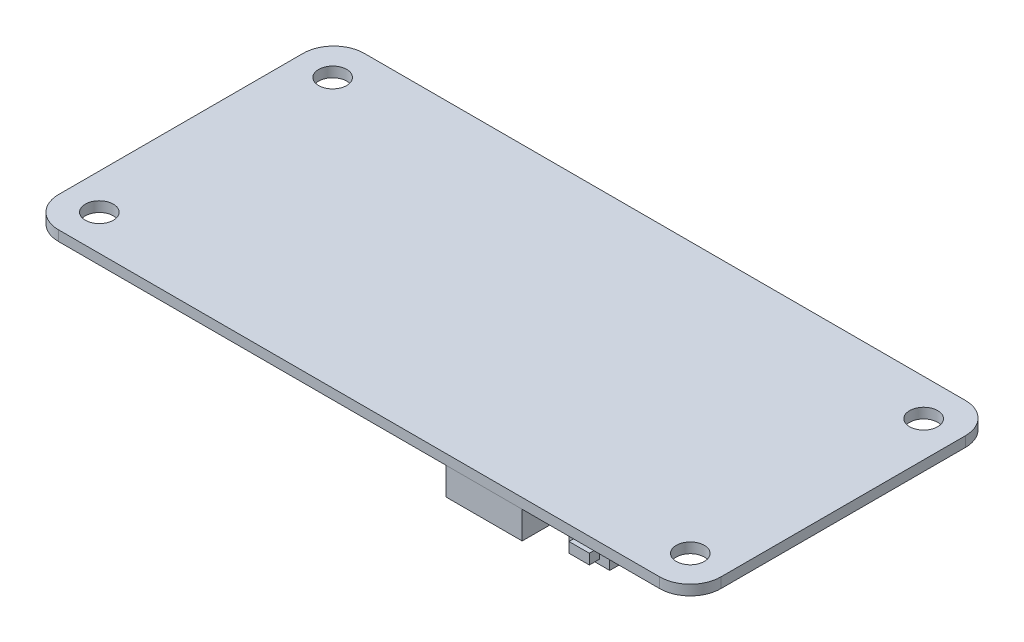
ISO-10303-21;
HEADER;
FILE_DESCRIPTION(('STEP AP214'),'2;1');
FILE_NAME('part.step','',(''),(''),'','','');
FILE_SCHEMA(('AUTOMOTIVE_DESIGN { 1 0 10303 214 1 1 1 1 }'));
ENDSEC;
DATA;
#1=APPLICATION_CONTEXT('core data for automotive mechanical design processes');
#2=APPLICATION_PROTOCOL_DEFINITION('international standard','automotive_design',2000,#1);
#3=PRODUCT_CONTEXT('',#1,'mechanical');
#4=PRODUCT('Part','Part','',(#3));
#5=PRODUCT_RELATED_PRODUCT_CATEGORY('part','',(#4));
#6=PRODUCT_DEFINITION_FORMATION('','',#4);
#7=PRODUCT_DEFINITION_CONTEXT('part definition',#1,'design');
#8=PRODUCT_DEFINITION('design','',#6,#7);
#9=PRODUCT_DEFINITION_SHAPE('','',#8);
#10=(LENGTH_UNIT() NAMED_UNIT(*) SI_UNIT(.MILLI.,.METRE.));
#11=(NAMED_UNIT(*) PLANE_ANGLE_UNIT() SI_UNIT($,.RADIAN.));
#12=(NAMED_UNIT(*) SI_UNIT($,.STERADIAN.) SOLID_ANGLE_UNIT());
#13=UNCERTAINTY_MEASURE_WITH_UNIT(LENGTH_MEASURE(1.E-05),#10,'distance_accuracy_value','');
#14=(GEOMETRIC_REPRESENTATION_CONTEXT(3) GLOBAL_UNCERTAINTY_ASSIGNED_CONTEXT((#13)) GLOBAL_UNIT_ASSIGNED_CONTEXT((#10,
#11,#12)) REPRESENTATION_CONTEXT('',''));
#15=CARTESIAN_POINT('',(0.,0.,0.));
#16=DIRECTION('',(0.,0.,1.));
#17=DIRECTION('',(1.,0.,0.));
#18=AXIS2_PLACEMENT_3D('',#15,#16,#17);
#19=CARTESIAN_POINT('',(23.5,-2.,13.9082141449593));
#20=DIRECTION('',(1.,0.,0.));
#21=DIRECTION('',(0.,0.,-1.));
#22=AXIS2_PLACEMENT_3D('',#19,#20,#21);
#23=PLANE('',#22);
#24=DIRECTION('',(0.,0.,-1.));
#25=VECTOR('',#24,1.);
#26=CARTESIAN_POINT('',(23.5,0.,13.9082141449593));
#27=LINE('',#26,#25);
#28=CARTESIAN_POINT('',(23.5,0.,13.9082141449593));
#29=VERTEX_POINT('',#28);
#30=CARTESIAN_POINT('',(23.5,0.,11.5));
#31=VERTEX_POINT('',#30);
#32=EDGE_CURVE('E131',#29,#31,#27,.T.);
#33=ORIENTED_EDGE('',*,*,#32,.F.);
#34=DIRECTION('',(0.,1.,0.));
#35=VECTOR('',#34,1.);
#36=CARTESIAN_POINT('',(23.5,-2.,13.9082141449593));
#37=LINE('',#36,#35);
#38=CARTESIAN_POINT('',(23.5,-2.,13.9082141449593));
#39=VERTEX_POINT('',#38);
#40=EDGE_CURVE('E12',#39,#29,#37,.T.);
#41=ORIENTED_EDGE('',*,*,#40,.F.);
#42=DIRECTION('',(0.,0.,-1.));
#43=VECTOR('',#42,1.);
#44=CARTESIAN_POINT('',(23.5,-2.,13.9082141449593));
#45=LINE('',#44,#43);
#46=CARTESIAN_POINT('',(23.5,-2.,11.5));
#47=VERTEX_POINT('',#46);
#48=EDGE_CURVE('E140',#39,#47,#45,.T.);
#49=ORIENTED_EDGE('',*,*,#48,.T.);
#50=DIRECTION('',(0.,1.,0.));
#51=VECTOR('',#50,1.);
#52=CARTESIAN_POINT('',(23.5,-2.,11.5));
#53=LINE('',#52,#51);
#54=EDGE_CURVE('E49',#47,#31,#53,.T.);
#55=ORIENTED_EDGE('',*,*,#54,.T.);
#56=EDGE_LOOP('',(#33,#41,#49,#55));
#57=FACE_BOUND('',#56,.T.);
#58=ADVANCED_FACE('F46',(#57),#23,.T.);
#59=CARTESIAN_POINT('',(19.5,-2.,13.9082141449593));
#60=DIRECTION('',(0.,0.,1.));
#61=DIRECTION('',(1.,0.,0.));
#62=AXIS2_PLACEMENT_3D('',#59,#60,#61);
#63=PLANE('',#62);
#64=DIRECTION('',(0.,-1.,0.));
#65=VECTOR('',#64,1.);
#66=CARTESIAN_POINT('',(20.5,-0.535773925293141,13.9082141449593));
#67=LINE('',#66,#65);
#68=CARTESIAN_POINT('',(20.5,-0.535773925293141,13.9082141449593));
#69=VERTEX_POINT('',#68);
#70=CARTESIAN_POINT('',(20.5,-1.53577392529314,13.9082141449593));
#71=VERTEX_POINT('',#70);
#72=EDGE_CURVE('E62',#69,#71,#67,.T.);
#73=ORIENTED_EDGE('',*,*,#72,.F.);
#74=DIRECTION('',(-1.,0.,0.));
#75=VECTOR('',#74,1.);
#76=CARTESIAN_POINT('',(20.5,-0.535773925293141,13.9082141449593));
#77=LINE('',#76,#75);
#78=CARTESIAN_POINT('',(22.5,-0.535773925293141,13.9082141449593));
#79=VERTEX_POINT('',#78);
#80=EDGE_CURVE('E66',#79,#69,#77,.T.);
#81=ORIENTED_EDGE('',*,*,#80,.F.);
#82=DIRECTION('',(0.,1.,0.));
#83=VECTOR('',#82,1.);
#84=CARTESIAN_POINT('',(22.5,-0.535773925293141,13.9082141449593));
#85=LINE('',#84,#83);
#86=CARTESIAN_POINT('',(22.5,-1.53577392529314,13.9082141449593));
#87=VERTEX_POINT('',#86);
#88=EDGE_CURVE('E271',#87,#79,#85,.T.);
#89=ORIENTED_EDGE('',*,*,#88,.F.);
#90=DIRECTION('',(1.,0.,0.));
#91=VECTOR('',#90,1.);
#92=CARTESIAN_POINT('',(20.5,-1.53577392529314,13.9082141449593));
#93=LINE('',#92,#91);
#94=EDGE_CURVE('E277',#71,#87,#93,.T.);
#95=ORIENTED_EDGE('',*,*,#94,.F.);
#96=EDGE_LOOP('',(#73,#81,#89,#95));
#97=FACE_BOUND('',#96,.T.);
#98=DIRECTION('',(1.,0.,0.));
#99=VECTOR('',#98,1.);
#100=CARTESIAN_POINT('',(19.5,0.,13.9082141449593));
#101=LINE('',#100,#99);
#102=CARTESIAN_POINT('',(19.5,0.,13.9082141449593));
#103=VERTEX_POINT('',#102);
#104=EDGE_CURVE('E144',#103,#29,#101,.T.);
#105=ORIENTED_EDGE('',*,*,#104,.F.);
#106=DIRECTION('',(0.,1.,0.));
#107=VECTOR('',#106,1.);
#108=CARTESIAN_POINT('',(19.5,-2.,13.9082141449593));
#109=LINE('',#108,#107);
#110=CARTESIAN_POINT('',(19.5,-2.,13.9082141449593));
#111=VERTEX_POINT('',#110);
#112=EDGE_CURVE('E54',#111,#103,#109,.T.);
#113=ORIENTED_EDGE('',*,*,#112,.F.);
#114=DIRECTION('',(1.,0.,0.));
#115=VECTOR('',#114,1.);
#116=CARTESIAN_POINT('',(19.5,-2.,13.9082141449593));
#117=LINE('',#116,#115);
#118=EDGE_CURVE('E150',#111,#39,#117,.T.);
#119=ORIENTED_EDGE('',*,*,#118,.T.);
#120=ORIENTED_EDGE('',*,*,#40,.T.);
#121=EDGE_LOOP('',(#105,#113,#119,#120));
#122=FACE_BOUND('',#121,.T.);
#123=ADVANCED_FACE('F173',(#97,#122),#63,.T.);
#124=CARTESIAN_POINT('',(19.5,-2.,11.5));
#125=DIRECTION('',(-1.,0.,0.));
#126=DIRECTION('',(0.,0.,1.));
#127=AXIS2_PLACEMENT_3D('',#124,#125,#126);
#128=PLANE('',#127);
#129=DIRECTION('',(0.,0.,1.));
#130=VECTOR('',#129,1.);
#131=CARTESIAN_POINT('',(19.5,0.,11.5));
#132=LINE('',#131,#130);
#133=CARTESIAN_POINT('',(19.5,0.,11.5));
#134=VERTEX_POINT('',#133);
#135=EDGE_CURVE('E155',#134,#103,#132,.T.);
#136=ORIENTED_EDGE('',*,*,#135,.F.);
#137=DIRECTION('',(0.,1.,0.));
#138=VECTOR('',#137,1.);
#139=CARTESIAN_POINT('',(19.5,-2.,11.5));
#140=LINE('',#139,#138);
#141=CARTESIAN_POINT('',(19.5,-2.,11.5));
#142=VERTEX_POINT('',#141);
#143=EDGE_CURVE('E160',#142,#134,#140,.T.);
#144=ORIENTED_EDGE('',*,*,#143,.F.);
#145=DIRECTION('',(0.,0.,1.));
#146=VECTOR('',#145,1.);
#147=CARTESIAN_POINT('',(19.5,-2.,11.5));
#148=LINE('',#147,#146);
#149=EDGE_CURVE('E147',#142,#111,#148,.T.);
#150=ORIENTED_EDGE('',*,*,#149,.T.);
#151=ORIENTED_EDGE('',*,*,#112,.T.);
#152=EDGE_LOOP('',(#136,#144,#150,#151));
#153=FACE_BOUND('',#152,.T.);
#154=ADVANCED_FACE('F179',(#153),#128,.T.);
#155=CARTESIAN_POINT('',(23.5,-2.,11.5));
#156=DIRECTION('',(0.,0.,-1.));
#157=DIRECTION('',(-1.,0.,0.));
#158=AXIS2_PLACEMENT_3D('',#155,#156,#157);
#159=PLANE('',#158);
#160=DIRECTION('',(-1.,0.,0.));
#161=VECTOR('',#160,1.);
#162=CARTESIAN_POINT('',(23.5,0.,11.5));
#163=LINE('',#162,#161);
#164=EDGE_CURVE('E134',#31,#134,#163,.T.);
#165=ORIENTED_EDGE('',*,*,#164,.F.);
#166=ORIENTED_EDGE('',*,*,#54,.F.);
#167=DIRECTION('',(-1.,0.,0.));
#168=VECTOR('',#167,1.);
#169=CARTESIAN_POINT('',(23.5,-2.,11.5));
#170=LINE('',#169,#168);
#171=EDGE_CURVE('E143',#47,#142,#170,.T.);
#172=ORIENTED_EDGE('',*,*,#171,.T.);
#173=ORIENTED_EDGE('',*,*,#143,.T.);
#174=EDGE_LOOP('',(#165,#166,#172,#173));
#175=FACE_BOUND('',#174,.T.);
#176=ADVANCED_FACE('F168',(#175),#159,.T.);
#177=CARTESIAN_POINT('',(0.,-2.,0.));
#178=DIRECTION('',(0.,1.,0.));
#179=DIRECTION('',(0.,0.,1.));
#180=AXIS2_PLACEMENT_3D('',#177,#178,#179);
#181=PLANE('',#180);
#182=ORIENTED_EDGE('',*,*,#48,.F.);
#183=ORIENTED_EDGE('',*,*,#118,.F.);
#184=ORIENTED_EDGE('',*,*,#149,.F.);
#185=ORIENTED_EDGE('',*,*,#171,.F.);
#186=EDGE_LOOP('',(#182,#183,#184,#185));
#187=FACE_BOUND('',#186,.T.);
#188=ADVANCED_FACE('F176',(#187),#181,.F.);
#189=CARTESIAN_POINT('',(0.,0.,0.));
#190=DIRECTION('',(0.,1.,0.));
#191=DIRECTION('',(0.,0.,1.));
#192=AXIS2_PLACEMENT_3D('',#189,#190,#191);
#193=PLANE('',#192);
#194=ORIENTED_EDGE('',*,*,#32,.T.);
#195=ORIENTED_EDGE('',*,*,#164,.T.);
#196=ORIENTED_EDGE('',*,*,#135,.T.);
#197=ORIENTED_EDGE('',*,*,#104,.T.);
#198=EDGE_LOOP('',(#194,#195,#196,#197));
#199=FACE_BOUND('',#198,.T.);
#200=ADVANCED_FACE('F170',(#199),#193,.T.);
#201=CARTESIAN_POINT('',(20.5,-0.535773925293141,14.9082141449593));
#202=DIRECTION('',(1.,0.,0.));
#203=DIRECTION('',(0.,0.,-1.));
#204=AXIS2_PLACEMENT_3D('',#201,#202,#203);
#205=PLANE('',#204);
#206=ORIENTED_EDGE('',*,*,#72,.T.);
#207=DIRECTION('',(0.,0.,-1.));
#208=VECTOR('',#207,1.);
#209=CARTESIAN_POINT('',(20.5,-1.53577392529314,14.9082141449593));
#210=LINE('',#209,#208);
#211=CARTESIAN_POINT('',(20.5,-1.53577392529314,14.9082141449593));
#212=VERTEX_POINT('',#211);
#213=EDGE_CURVE('E114',#212,#71,#210,.T.);
#214=ORIENTED_EDGE('',*,*,#213,.F.);
#215=DIRECTION('',(0.,-1.,0.));
#216=VECTOR('',#215,1.);
#217=CARTESIAN_POINT('',(20.5,-0.535773925293141,14.9082141449593));
#218=LINE('',#217,#216);
#219=CARTESIAN_POINT('',(20.5,-0.535773925293141,14.9082141449593));
#220=VERTEX_POINT('',#219);
#221=EDGE_CURVE('E120',#220,#212,#218,.T.);
#222=ORIENTED_EDGE('',*,*,#221,.F.);
#223=DIRECTION('',(0.,0.,-1.));
#224=VECTOR('',#223,1.);
#225=CARTESIAN_POINT('',(20.5,-0.535773925293141,14.9082141449593));
#226=LINE('',#225,#224);
#227=EDGE_CURVE('E269',#220,#69,#226,.T.);
#228=ORIENTED_EDGE('',*,*,#227,.T.);
#229=EDGE_LOOP('',(#206,#214,#222,#228));
#230=FACE_BOUND('',#229,.T.);
#231=ADVANCED_FACE('F130',(#230),#205,.F.);
#232=CARTESIAN_POINT('',(20.5,-1.53577392529314,14.9082141449593));
#233=DIRECTION('',(0.,1.,0.));
#234=DIRECTION('',(0.,0.,1.));
#235=AXIS2_PLACEMENT_3D('',#232,#233,#234);
#236=PLANE('',#235);
#237=ORIENTED_EDGE('',*,*,#94,.T.);
#238=DIRECTION('',(0.,0.,-1.));
#239=VECTOR('',#238,1.);
#240=CARTESIAN_POINT('',(22.5,-1.53577392529314,14.9082141449593));
#241=LINE('',#240,#239);
#242=CARTESIAN_POINT('',(22.5,-1.53577392529314,14.9082141449593));
#243=VERTEX_POINT('',#242);
#244=EDGE_CURVE('E116',#243,#87,#241,.T.);
#245=ORIENTED_EDGE('',*,*,#244,.F.);
#246=DIRECTION('',(1.,0.,0.));
#247=VECTOR('',#246,1.);
#248=CARTESIAN_POINT('',(20.5,-1.53577392529314,14.9082141449593));
#249=LINE('',#248,#247);
#250=EDGE_CURVE('E109',#212,#243,#249,.T.);
#251=ORIENTED_EDGE('',*,*,#250,.F.);
#252=ORIENTED_EDGE('',*,*,#213,.T.);
#253=EDGE_LOOP('',(#237,#245,#251,#252));
#254=FACE_BOUND('',#253,.T.);
#255=ADVANCED_FACE('F112',(#254),#236,.F.);
#256=CARTESIAN_POINT('',(22.5,-0.535773925293141,14.9082141449593));
#257=DIRECTION('',(-1.,0.,0.));
#258=DIRECTION('',(0.,0.,1.));
#259=AXIS2_PLACEMENT_3D('',#256,#257,#258);
#260=PLANE('',#259);
#261=ORIENTED_EDGE('',*,*,#88,.T.);
#262=DIRECTION('',(0.,0.,-1.));
#263=VECTOR('',#262,1.);
#264=CARTESIAN_POINT('',(22.5,-0.535773925293141,14.9082141449593));
#265=LINE('',#264,#263);
#266=CARTESIAN_POINT('',(22.5,-0.535773925293141,14.9082141449593));
#267=VERTEX_POINT('',#266);
#268=EDGE_CURVE('E136',#267,#79,#265,.T.);
#269=ORIENTED_EDGE('',*,*,#268,.F.);
#270=DIRECTION('',(0.,1.,0.));
#271=VECTOR('',#270,1.);
#272=CARTESIAN_POINT('',(22.5,-0.535773925293141,14.9082141449593));
#273=LINE('',#272,#271);
#274=EDGE_CURVE('E119',#243,#267,#273,.T.);
#275=ORIENTED_EDGE('',*,*,#274,.F.);
#276=ORIENTED_EDGE('',*,*,#244,.T.);
#277=EDGE_LOOP('',(#261,#269,#275,#276));
#278=FACE_BOUND('',#277,.T.);
#279=ADVANCED_FACE('F217',(#278),#260,.F.);
#280=CARTESIAN_POINT('',(20.5,-0.535773925293141,14.9082141449593));
#281=DIRECTION('',(0.,-1.,0.));
#282=DIRECTION('',(0.,0.,-1.));
#283=AXIS2_PLACEMENT_3D('',#280,#281,#282);
#284=PLANE('',#283);
#285=ORIENTED_EDGE('',*,*,#80,.T.);
#286=ORIENTED_EDGE('',*,*,#227,.F.);
#287=DIRECTION('',(-1.,0.,0.));
#288=VECTOR('',#287,1.);
#289=CARTESIAN_POINT('',(20.5,-0.535773925293141,14.9082141449593));
#290=LINE('',#289,#288);
#291=EDGE_CURVE('E125',#267,#220,#290,.T.);
#292=ORIENTED_EDGE('',*,*,#291,.F.);
#293=ORIENTED_EDGE('',*,*,#268,.T.);
#294=EDGE_LOOP('',(#285,#286,#292,#293));
#295=FACE_BOUND('',#294,.T.);
#296=ADVANCED_FACE('F226',(#295),#284,.F.);
#297=CARTESIAN_POINT('',(0.,0.,14.9082141449593));
#298=DIRECTION('',(0.,0.,1.));
#299=DIRECTION('',(1.,0.,0.));
#300=AXIS2_PLACEMENT_3D('',#297,#298,#299);
#301=PLANE('',#300);
#302=ORIENTED_EDGE('',*,*,#221,.T.);
#303=ORIENTED_EDGE('',*,*,#250,.T.);
#304=ORIENTED_EDGE('',*,*,#274,.T.);
#305=ORIENTED_EDGE('',*,*,#291,.T.);
#306=EDGE_LOOP('',(#302,#303,#304,#305));
#307=FACE_BOUND('',#306,.T.);
#308=ADVANCED_FACE('F123',(#307),#301,.T.);
#309=CLOSED_SHELL('',(#58,#123,#154,#176,#188,#200,#231,#255,#279,#296,#308));
#310=MANIFOLD_SOLID_BREP('B2',#309);
#311=CARTESIAN_POINT('',(16.,-2.7,15.));
#312=DIRECTION('',(1.,0.,0.));
#313=DIRECTION('',(0.,0.,-1.));
#314=AXIS2_PLACEMENT_3D('',#311,#312,#313);
#315=PLANE('',#314);
#316=DIRECTION('',(0.,0.,-1.));
#317=VECTOR('',#316,1.);
#318=CARTESIAN_POINT('',(16.,0.,15.));
#319=LINE('',#318,#317);
#320=CARTESIAN_POINT('',(16.,0.,15.));
#321=VERTEX_POINT('',#320);
#322=CARTESIAN_POINT('',(16.,0.,11.00711080893));
#323=VERTEX_POINT('',#322);
#324=EDGE_CURVE('E357',#321,#323,#319,.T.);
#325=ORIENTED_EDGE('',*,*,#324,.F.);
#326=DIRECTION('',(0.,1.,0.));
#327=VECTOR('',#326,1.);
#328=CARTESIAN_POINT('',(16.,-2.7,15.));
#329=LINE('',#328,#327);
#330=CARTESIAN_POINT('',(16.,-2.7,15.));
#331=VERTEX_POINT('',#330);
#332=EDGE_CURVE('E44',#331,#321,#329,.T.);
#333=ORIENTED_EDGE('',*,*,#332,.F.);
#334=DIRECTION('',(0.,0.,-1.));
#335=VECTOR('',#334,1.);
#336=CARTESIAN_POINT('',(16.,-2.7,15.));
#337=LINE('',#336,#335);
#338=CARTESIAN_POINT('',(16.,-2.7,11.00711080893));
#339=VERTEX_POINT('',#338);
#340=EDGE_CURVE('E351',#331,#339,#337,.T.);
#341=ORIENTED_EDGE('',*,*,#340,.T.);
#342=DIRECTION('',(0.,1.,0.));
#343=VECTOR('',#342,1.);
#344=CARTESIAN_POINT('',(16.,-2.7,11.00711080893));
#345=LINE('',#344,#343);
#346=EDGE_CURVE('E296',#339,#323,#345,.T.);
#347=ORIENTED_EDGE('',*,*,#346,.T.);
#348=EDGE_LOOP('',(#325,#333,#341,#347));
#349=FACE_BOUND('',#348,.T.);
#350=ADVANCED_FACE('F293',(#349),#315,.T.);
#351=CARTESIAN_POINT('',(8.49999999999999,-2.7,15.));
#352=DIRECTION('',(0.,0.,1.));
#353=DIRECTION('',(1.,0.,0.));
#354=AXIS2_PLACEMENT_3D('',#351,#352,#353);
#355=PLANE('',#354);
#356=DIRECTION('',(1.,0.,0.));
#357=VECTOR('',#356,1.);
#358=CARTESIAN_POINT('',(8.49999999999999,0.,15.));
#359=LINE('',#358,#357);
#360=CARTESIAN_POINT('',(8.49999999999999,0.,15.));
#361=VERTEX_POINT('',#360);
#362=EDGE_CURVE('E353',#361,#321,#359,.T.);
#363=ORIENTED_EDGE('',*,*,#362,.F.);
#364=DIRECTION('',(0.,1.,0.));
#365=VECTOR('',#364,1.);
#366=CARTESIAN_POINT('',(8.49999999999999,-2.7,15.));
#367=LINE('',#366,#365);
#368=CARTESIAN_POINT('',(8.49999999999999,-2.7,15.));
#369=VERTEX_POINT('',#368);
#370=EDGE_CURVE('E302',#369,#361,#367,.T.);
#371=ORIENTED_EDGE('',*,*,#370,.F.);
#372=DIRECTION('',(1.,0.,0.));
#373=VECTOR('',#372,1.);
#374=CARTESIAN_POINT('',(8.49999999999999,-2.7,15.));
#375=LINE('',#374,#373);
#376=EDGE_CURVE('E348',#369,#331,#375,.T.);
#377=ORIENTED_EDGE('',*,*,#376,.T.);
#378=ORIENTED_EDGE('',*,*,#332,.T.);
#379=EDGE_LOOP('',(#363,#371,#377,#378));
#380=FACE_BOUND('',#379,.T.);
#381=ADVANCED_FACE('F367',(#380),#355,.T.);
#382=CARTESIAN_POINT('',(8.49999999999999,-2.7,11.00711080893));
#383=DIRECTION('',(-1.,0.,0.));
#384=DIRECTION('',(0.,0.,1.));
#385=AXIS2_PLACEMENT_3D('',#382,#383,#384);
#386=PLANE('',#385);
#387=DIRECTION('',(0.,0.,1.));
#388=VECTOR('',#387,1.);
#389=CARTESIAN_POINT('',(8.49999999999999,0.,11.00711080893));
#390=LINE('',#389,#388);
#391=CARTESIAN_POINT('',(8.49999999999999,0.,11.00711080893));
#392=VERTEX_POINT('',#391);
#393=EDGE_CURVE('E343',#392,#361,#390,.T.);
#394=ORIENTED_EDGE('',*,*,#393,.F.);
#395=DIRECTION('',(0.,1.,0.));
#396=VECTOR('',#395,1.);
#397=CARTESIAN_POINT('',(8.49999999999999,-2.7,11.00711080893));
#398=LINE('',#397,#396);
#399=CARTESIAN_POINT('',(8.49999999999999,-2.7,11.00711080893));
#400=VERTEX_POINT('',#399);
#401=EDGE_CURVE('E338',#400,#392,#398,.T.);
#402=ORIENTED_EDGE('',*,*,#401,.F.);
#403=DIRECTION('',(0.,0.,1.));
#404=VECTOR('',#403,1.);
#405=CARTESIAN_POINT('',(8.49999999999999,-2.7,11.00711080893));
#406=LINE('',#405,#404);
#407=EDGE_CURVE('E341',#400,#369,#406,.T.);
#408=ORIENTED_EDGE('',*,*,#407,.T.);
#409=ORIENTED_EDGE('',*,*,#370,.T.);
#410=EDGE_LOOP('',(#394,#402,#408,#409));
#411=FACE_BOUND('',#410,.T.);
#412=ADVANCED_FACE('F340',(#411),#386,.T.);
#413=CARTESIAN_POINT('',(16.,-2.7,11.00711080893));
#414=DIRECTION('',(0.,0.,-1.));
#415=DIRECTION('',(-1.,0.,0.));
#416=AXIS2_PLACEMENT_3D('',#413,#414,#415);
#417=PLANE('',#416);
#418=DIRECTION('',(-1.,0.,0.));
#419=VECTOR('',#418,1.);
#420=CARTESIAN_POINT('',(16.,0.,11.00711080893));
#421=LINE('',#420,#419);
#422=EDGE_CURVE('E360',#323,#392,#421,.T.);
#423=ORIENTED_EDGE('',*,*,#422,.F.);
#424=ORIENTED_EDGE('',*,*,#346,.F.);
#425=DIRECTION('',(-1.,0.,0.));
#426=VECTOR('',#425,1.);
#427=CARTESIAN_POINT('',(16.,-2.7,11.00711080893));
#428=LINE('',#427,#426);
#429=EDGE_CURVE('E347',#339,#400,#428,.T.);
#430=ORIENTED_EDGE('',*,*,#429,.T.);
#431=ORIENTED_EDGE('',*,*,#401,.T.);
#432=EDGE_LOOP('',(#423,#424,#430,#431));
#433=FACE_BOUND('',#432,.T.);
#434=ADVANCED_FACE('F350',(#433),#417,.T.);
#435=CARTESIAN_POINT('',(0.,-2.7,0.));
#436=DIRECTION('',(0.,1.,0.));
#437=DIRECTION('',(0.,0.,1.));
#438=AXIS2_PLACEMENT_3D('',#435,#436,#437);
#439=PLANE('',#438);
#440=ORIENTED_EDGE('',*,*,#340,.F.);
#441=ORIENTED_EDGE('',*,*,#376,.F.);
#442=ORIENTED_EDGE('',*,*,#407,.F.);
#443=ORIENTED_EDGE('',*,*,#429,.F.);
#444=EDGE_LOOP('',(#440,#441,#442,#443));
#445=FACE_BOUND('',#444,.T.);
#446=ADVANCED_FACE('F346',(#445),#439,.F.);
#447=CARTESIAN_POINT('',(0.,0.,0.));
#448=DIRECTION('',(0.,1.,0.));
#449=DIRECTION('',(0.,0.,1.));
#450=AXIS2_PLACEMENT_3D('',#447,#448,#449);
#451=PLANE('',#450);
#452=ORIENTED_EDGE('',*,*,#324,.T.);
#453=ORIENTED_EDGE('',*,*,#422,.T.);
#454=ORIENTED_EDGE('',*,*,#393,.T.);
#455=ORIENTED_EDGE('',*,*,#362,.T.);
#456=EDGE_LOOP('',(#452,#453,#454,#455));
#457=FACE_BOUND('',#456,.T.);
#458=ADVANCED_FACE('F366',(#457),#451,.T.);
#459=CLOSED_SHELL('',(#350,#381,#412,#434,#446,#458));
#460=MANIFOLD_SOLID_BREP('B6',#459);
#461=CARTESIAN_POINT('',(-29.5,1.,-12.));
#462=DIRECTION('',(0.,1.,0.));
#463=DIRECTION('',(0.,0.,1.));
#464=AXIS2_PLACEMENT_3D('',#461,#462,#463);
#465=PLANE('',#464);
#466=CARTESIAN_POINT('',(-29.,1.,11.5));
#467=DIRECTION('',(0.,1.,0.));
#468=DIRECTION('',(0.,0.,1.));
#469=AXIS2_PLACEMENT_3D('',#466,#467,#468);
#470=CIRCLE('',#469,1.375);
#471=CARTESIAN_POINT('',(-29.,1.,12.875));
#472=VERTEX_POINT('',#471);
#473=EDGE_CURVE('E571',#472,#472,#470,.T.);
#474=ORIENTED_EDGE('',*,*,#473,.F.);
#475=EDGE_LOOP('',(#474));
#476=FACE_BOUND('',#475,.T.);
#477=CARTESIAN_POINT('',(29.,1.,-11.4));
#478=DIRECTION('',(0.,1.,0.));
#479=DIRECTION('',(0.,0.,1.));
#480=AXIS2_PLACEMENT_3D('',#477,#478,#479);
#481=CIRCLE('',#480,1.375);
#482=CARTESIAN_POINT('',(29.,1.,-10.025));
#483=VERTEX_POINT('',#482);
#484=EDGE_CURVE('E517',#483,#483,#481,.T.);
#485=ORIENTED_EDGE('',*,*,#484,.F.);
#486=EDGE_LOOP('',(#485));
#487=FACE_BOUND('',#486,.T.);
#488=CARTESIAN_POINT('',(-29.5,1.,-12.));
#489=DIRECTION('',(0.,1.,0.));
#490=DIRECTION('',(0.,0.,1.));
#491=AXIS2_PLACEMENT_3D('',#488,#489,#490);
#492=CIRCLE('',#491,3.);
#493=CARTESIAN_POINT('',(-29.5,1.,-15.));
#494=VERTEX_POINT('',#493);
#495=CARTESIAN_POINT('',(-32.5,1.,-12.));
#496=VERTEX_POINT('',#495);
#497=EDGE_CURVE('E528',#494,#496,#492,.T.);
#498=ORIENTED_EDGE('',*,*,#497,.T.);
#499=DIRECTION('',(0.,0.,1.));
#500=VECTOR('',#499,1.);
#501=CARTESIAN_POINT('',(-32.5,1.,-12.));
#502=LINE('',#501,#500);
#503=CARTESIAN_POINT('',(-32.5,1.,12.));
#504=VERTEX_POINT('',#503);
#505=EDGE_CURVE('E476',#496,#504,#502,.T.);
#506=ORIENTED_EDGE('',*,*,#505,.T.);
#507=CARTESIAN_POINT('',(-29.5,1.,12.));
#508=DIRECTION('',(0.,1.,0.));
#509=DIRECTION('',(0.,0.,1.));
#510=AXIS2_PLACEMENT_3D('',#507,#508,#509);
#511=CIRCLE('',#510,3.);
#512=CARTESIAN_POINT('',(-29.5,1.,15.));
#513=VERTEX_POINT('',#512);
#514=EDGE_CURVE('E543',#504,#513,#511,.T.);
#515=ORIENTED_EDGE('',*,*,#514,.T.);
#516=DIRECTION('',(1.,0.,0.));
#517=VECTOR('',#516,1.);
#518=CARTESIAN_POINT('',(-29.5,1.,15.));
#519=LINE('',#518,#517);
#520=CARTESIAN_POINT('',(29.5,1.,15.));
#521=VERTEX_POINT('',#520);
#522=EDGE_CURVE('E556',#513,#521,#519,.T.);
#523=ORIENTED_EDGE('',*,*,#522,.T.);
#524=CARTESIAN_POINT('',(29.5,1.,12.));
#525=DIRECTION('',(0.,1.,0.));
#526=DIRECTION('',(0.,0.,1.));
#527=AXIS2_PLACEMENT_3D('',#524,#525,#526);
#528=CIRCLE('',#527,3.);
#529=CARTESIAN_POINT('',(32.5,1.,12.));
#530=VERTEX_POINT('',#529);
#531=EDGE_CURVE('E495',#521,#530,#528,.T.);
#532=ORIENTED_EDGE('',*,*,#531,.T.);
#533=DIRECTION('',(0.,0.,-1.));
#534=VECTOR('',#533,1.);
#535=CARTESIAN_POINT('',(32.5,1.,12.));
#536=LINE('',#535,#534);
#537=CARTESIAN_POINT('',(32.5,1.,-12.));
#538=VERTEX_POINT('',#537);
#539=EDGE_CURVE('E489',#530,#538,#536,.T.);
#540=ORIENTED_EDGE('',*,*,#539,.T.);
#541=CARTESIAN_POINT('',(29.5,1.,-12.));
#542=DIRECTION('',(0.,1.,0.));
#543=DIRECTION('',(0.,0.,1.));
#544=AXIS2_PLACEMENT_3D('',#541,#542,#543);
#545=CIRCLE('',#544,3.);
#546=CARTESIAN_POINT('',(29.5,1.,-15.));
#547=VERTEX_POINT('',#546);
#548=EDGE_CURVE('E493',#538,#547,#545,.T.);
#549=ORIENTED_EDGE('',*,*,#548,.T.);
#550=DIRECTION('',(-1.,0.,0.));
#551=VECTOR('',#550,1.);
#552=CARTESIAN_POINT('',(29.5,1.,-15.));
#553=LINE('',#552,#551);
#554=EDGE_CURVE('E433',#547,#494,#553,.T.);
#555=ORIENTED_EDGE('',*,*,#554,.T.);
#556=EDGE_LOOP('',(#498,#506,#515,#523,#532,#540,#549,#555));
#557=FACE_BOUND('',#556,.T.);
#558=CARTESIAN_POINT('',(29.,1.,11.5));
#559=DIRECTION('',(0.,1.,0.));
#560=DIRECTION('',(0.,0.,1.));
#561=AXIS2_PLACEMENT_3D('',#558,#559,#560);
#562=CIRCLE('',#561,1.375);
#563=CARTESIAN_POINT('',(29.,1.,12.875));
#564=VERTEX_POINT('',#563);
#565=EDGE_CURVE('E565',#564,#564,#562,.T.);
#566=ORIENTED_EDGE('',*,*,#565,.F.);
#567=EDGE_LOOP('',(#566));
#568=FACE_BOUND('',#567,.T.);
#569=CARTESIAN_POINT('',(-29.,1.,-11.4));
#570=DIRECTION('',(0.,1.,0.));
#571=DIRECTION('',(0.,0.,1.));
#572=AXIS2_PLACEMENT_3D('',#569,#570,#571);
#573=CIRCLE('',#572,1.375);
#574=CARTESIAN_POINT('',(-29.,1.,-10.025));
#575=VERTEX_POINT('',#574);
#576=EDGE_CURVE('E577',#575,#575,#573,.T.);
#577=ORIENTED_EDGE('',*,*,#576,.F.);
#578=EDGE_LOOP('',(#577));
#579=FACE_BOUND('',#578,.T.);
#580=ADVANCED_FACE('F416',(#476,#487,#557,#568,#579),#465,.T.);
#581=CARTESIAN_POINT('',(-29.5,0.,-12.));
#582=DIRECTION('',(0.,1.,0.));
#583=DIRECTION('',(0.,0.,1.));
#584=AXIS2_PLACEMENT_3D('',#581,#582,#583);
#585=PLANE('',#584);
#586=CARTESIAN_POINT('',(-29.5,0.,-12.));
#587=DIRECTION('',(0.,1.,0.));
#588=DIRECTION('',(0.,0.,1.));
#589=AXIS2_PLACEMENT_3D('',#586,#587,#588);
#590=CIRCLE('',#589,3.);
#591=CARTESIAN_POINT('',(-29.5,0.,-15.));
#592=VERTEX_POINT('',#591);
#593=CARTESIAN_POINT('',(-32.5,0.,-12.));
#594=VERTEX_POINT('',#593);
#595=EDGE_CURVE('E513',#592,#594,#590,.T.);
#596=ORIENTED_EDGE('',*,*,#595,.F.);
#597=DIRECTION('',(-1.,0.,0.));
#598=VECTOR('',#597,1.);
#599=CARTESIAN_POINT('',(29.5,0.,-15.));
#600=LINE('',#599,#598);
#601=CARTESIAN_POINT('',(29.5,0.,-15.));
#602=VERTEX_POINT('',#601);
#603=EDGE_CURVE('E468',#602,#592,#600,.T.);
#604=ORIENTED_EDGE('',*,*,#603,.F.);
#605=CARTESIAN_POINT('',(29.5,0.,-12.));
#606=DIRECTION('',(0.,1.,0.));
#607=DIRECTION('',(0.,0.,1.));
#608=AXIS2_PLACEMENT_3D('',#605,#606,#607);
#609=CIRCLE('',#608,3.);
#610=CARTESIAN_POINT('',(32.5,0.,-12.));
#611=VERTEX_POINT('',#610);
#612=EDGE_CURVE('E462',#611,#602,#609,.T.);
#613=ORIENTED_EDGE('',*,*,#612,.F.);
#614=DIRECTION('',(0.,0.,-1.));
#615=VECTOR('',#614,1.);
#616=CARTESIAN_POINT('',(32.5,0.,12.));
#617=LINE('',#616,#615);
#618=CARTESIAN_POINT('',(32.5,0.,12.));
#619=VERTEX_POINT('',#618);
#620=EDGE_CURVE('E503',#619,#611,#617,.T.);
#621=ORIENTED_EDGE('',*,*,#620,.F.);
#622=CARTESIAN_POINT('',(29.5,0.,12.));
#623=DIRECTION('',(0.,1.,0.));
#624=DIRECTION('',(0.,0.,1.));
#625=AXIS2_PLACEMENT_3D('',#622,#623,#624);
#626=CIRCLE('',#625,3.);
#627=CARTESIAN_POINT('',(29.5,0.,15.));
#628=VERTEX_POINT('',#627);
#629=EDGE_CURVE('E523',#628,#619,#626,.T.);
#630=ORIENTED_EDGE('',*,*,#629,.F.);
#631=DIRECTION('',(1.,0.,0.));
#632=VECTOR('',#631,1.);
#633=CARTESIAN_POINT('',(-29.5,0.,15.));
#634=LINE('',#633,#632);
#635=CARTESIAN_POINT('',(-29.5,0.,15.));
#636=VERTEX_POINT('',#635);
#637=EDGE_CURVE('E521',#636,#628,#634,.T.);
#638=ORIENTED_EDGE('',*,*,#637,.F.);
#639=CARTESIAN_POINT('',(-29.5,0.,12.));
#640=DIRECTION('',(0.,1.,0.));
#641=DIRECTION('',(0.,0.,1.));
#642=AXIS2_PLACEMENT_3D('',#639,#640,#641);
#643=CIRCLE('',#642,3.);
#644=CARTESIAN_POINT('',(-32.5,0.,12.));
#645=VERTEX_POINT('',#644);
#646=EDGE_CURVE('E519',#645,#636,#643,.T.);
#647=ORIENTED_EDGE('',*,*,#646,.F.);
#648=DIRECTION('',(0.,0.,1.));
#649=VECTOR('',#648,1.);
#650=CARTESIAN_POINT('',(-32.5,0.,-12.));
#651=LINE('',#650,#649);
#652=EDGE_CURVE('E516',#594,#645,#651,.T.);
#653=ORIENTED_EDGE('',*,*,#652,.F.);
#654=EDGE_LOOP('',(#596,#604,#613,#621,#630,#638,#647,#653));
#655=FACE_BOUND('',#654,.T.);
#656=CARTESIAN_POINT('',(29.,0.,-11.4));
#657=DIRECTION('',(0.,1.,0.));
#658=DIRECTION('',(0.,0.,1.));
#659=AXIS2_PLACEMENT_3D('',#656,#657,#658);
#660=CIRCLE('',#659,1.375);
#661=CARTESIAN_POINT('',(29.,0.,-10.025));
#662=VERTEX_POINT('',#661);
#663=EDGE_CURVE('E562',#662,#662,#660,.T.);
#664=ORIENTED_EDGE('',*,*,#663,.T.);
#665=EDGE_LOOP('',(#664));
#666=FACE_BOUND('',#665,.T.);
#667=CARTESIAN_POINT('',(29.,0.,11.5));
#668=DIRECTION('',(0.,1.,0.));
#669=DIRECTION('',(0.,0.,1.));
#670=AXIS2_PLACEMENT_3D('',#667,#668,#669);
#671=CIRCLE('',#670,1.375);
#672=CARTESIAN_POINT('',(29.,0.,12.875));
#673=VERTEX_POINT('',#672);
#674=EDGE_CURVE('E568',#673,#673,#671,.T.);
#675=ORIENTED_EDGE('',*,*,#674,.T.);
#676=EDGE_LOOP('',(#675));
#677=FACE_BOUND('',#676,.T.);
#678=CARTESIAN_POINT('',(-29.,0.,11.5));
#679=DIRECTION('',(0.,1.,0.));
#680=DIRECTION('',(0.,0.,1.));
#681=AXIS2_PLACEMENT_3D('',#678,#679,#680);
#682=CIRCLE('',#681,1.375);
#683=CARTESIAN_POINT('',(-29.,0.,12.875));
#684=VERTEX_POINT('',#683);
#685=EDGE_CURVE('E574',#684,#684,#682,.T.);
#686=ORIENTED_EDGE('',*,*,#685,.T.);
#687=EDGE_LOOP('',(#686));
#688=FACE_BOUND('',#687,.T.);
#689=CARTESIAN_POINT('',(-29.,0.,-11.4));
#690=DIRECTION('',(0.,1.,0.));
#691=DIRECTION('',(0.,0.,1.));
#692=AXIS2_PLACEMENT_3D('',#689,#690,#691);
#693=CIRCLE('',#692,1.375);
#694=CARTESIAN_POINT('',(-29.,0.,-10.025));
#695=VERTEX_POINT('',#694);
#696=EDGE_CURVE('E580',#695,#695,#693,.T.);
#697=ORIENTED_EDGE('',*,*,#696,.T.);
#698=EDGE_LOOP('',(#697));
#699=FACE_BOUND('',#698,.T.);
#700=ADVANCED_FACE('F547',(#655,#666,#677,#688,#699),#585,.F.);
#701=CARTESIAN_POINT('',(-29.5,1.,-12.));
#702=DIRECTION('',(0.,-1.,0.));
#703=DIRECTION('',(0.,0.,-1.));
#704=AXIS2_PLACEMENT_3D('',#701,#702,#703);
#705=CYLINDRICAL_SURFACE('',#704,3.);
#706=ORIENTED_EDGE('',*,*,#595,.T.);
#707=DIRECTION('',(0.,-1.,0.));
#708=VECTOR('',#707,1.);
#709=CARTESIAN_POINT('',(-32.5,1.,-12.));
#710=LINE('',#709,#708);
#711=EDGE_CURVE('E291',#496,#594,#710,.T.);
#712=ORIENTED_EDGE('',*,*,#711,.F.);
#713=ORIENTED_EDGE('',*,*,#497,.F.);
#714=DIRECTION('',(0.,-1.,0.));
#715=VECTOR('',#714,1.);
#716=CARTESIAN_POINT('',(-29.5,1.,-15.));
#717=LINE('',#716,#715);
#718=EDGE_CURVE('E509',#494,#592,#717,.T.);
#719=ORIENTED_EDGE('',*,*,#718,.T.);
#720=EDGE_LOOP('',(#706,#712,#713,#719));
#721=FACE_BOUND('',#720,.T.);
#722=ADVANCED_FACE('F418',(#721),#705,.T.);
#723=CARTESIAN_POINT('',(-32.5,1.,-12.));
#724=DIRECTION('',(1.,0.,0.));
#725=DIRECTION('',(0.,0.,-1.));
#726=AXIS2_PLACEMENT_3D('',#723,#724,#725);
#727=PLANE('',#726);
#728=ORIENTED_EDGE('',*,*,#652,.T.);
#729=DIRECTION('',(0.,-1.,0.));
#730=VECTOR('',#729,1.);
#731=CARTESIAN_POINT('',(-32.5,1.,12.));
#732=LINE('',#731,#730);
#733=EDGE_CURVE('E425',#504,#645,#732,.T.);
#734=ORIENTED_EDGE('',*,*,#733,.F.);
#735=ORIENTED_EDGE('',*,*,#505,.F.);
#736=ORIENTED_EDGE('',*,*,#711,.T.);
#737=EDGE_LOOP('',(#728,#734,#735,#736));
#738=FACE_BOUND('',#737,.T.);
#739=ADVANCED_FACE('F614',(#738),#727,.F.);
#740=CARTESIAN_POINT('',(-29.5,1.,12.));
#741=DIRECTION('',(0.,-1.,0.));
#742=DIRECTION('',(0.,0.,-1.));
#743=AXIS2_PLACEMENT_3D('',#740,#741,#742);
#744=CYLINDRICAL_SURFACE('',#743,3.);
#745=ORIENTED_EDGE('',*,*,#646,.T.);
#746=DIRECTION('',(0.,-1.,0.));
#747=VECTOR('',#746,1.);
#748=CARTESIAN_POINT('',(-29.5,1.,15.));
#749=LINE('',#748,#747);
#750=EDGE_CURVE('E535',#513,#636,#749,.T.);
#751=ORIENTED_EDGE('',*,*,#750,.F.);
#752=ORIENTED_EDGE('',*,*,#514,.F.);
#753=ORIENTED_EDGE('',*,*,#733,.T.);
#754=EDGE_LOOP('',(#745,#751,#752,#753));
#755=FACE_BOUND('',#754,.T.);
#756=ADVANCED_FACE('F541',(#755),#744,.T.);
#757=CARTESIAN_POINT('',(-29.5,1.,15.));
#758=DIRECTION('',(0.,0.,-1.));
#759=DIRECTION('',(-1.,0.,0.));
#760=AXIS2_PLACEMENT_3D('',#757,#758,#759);
#761=PLANE('',#760);
#762=ORIENTED_EDGE('',*,*,#637,.T.);
#763=DIRECTION('',(0.,-1.,0.));
#764=VECTOR('',#763,1.);
#765=CARTESIAN_POINT('',(29.5,1.,15.));
#766=LINE('',#765,#764);
#767=EDGE_CURVE('E532',#521,#628,#766,.T.);
#768=ORIENTED_EDGE('',*,*,#767,.F.);
#769=ORIENTED_EDGE('',*,*,#522,.F.);
#770=ORIENTED_EDGE('',*,*,#750,.T.);
#771=EDGE_LOOP('',(#762,#768,#769,#770));
#772=FACE_BOUND('',#771,.T.);
#773=ADVANCED_FACE('F552',(#772),#761,.F.);
#774=CARTESIAN_POINT('',(29.5,1.,12.));
#775=DIRECTION('',(0.,-1.,0.));
#776=DIRECTION('',(0.,0.,-1.));
#777=AXIS2_PLACEMENT_3D('',#774,#775,#776);
#778=CYLINDRICAL_SURFACE('',#777,3.);
#779=ORIENTED_EDGE('',*,*,#629,.T.);
#780=DIRECTION('',(0.,-1.,0.));
#781=VECTOR('',#780,1.);
#782=CARTESIAN_POINT('',(32.5,1.,12.));
#783=LINE('',#782,#781);
#784=EDGE_CURVE('E504',#530,#619,#783,.T.);
#785=ORIENTED_EDGE('',*,*,#784,.F.);
#786=ORIENTED_EDGE('',*,*,#531,.F.);
#787=ORIENTED_EDGE('',*,*,#767,.T.);
#788=EDGE_LOOP('',(#779,#785,#786,#787));
#789=FACE_BOUND('',#788,.T.);
#790=ADVANCED_FACE('F555',(#789),#778,.T.);
#791=CARTESIAN_POINT('',(32.5,1.,12.));
#792=DIRECTION('',(-1.,0.,0.));
#793=DIRECTION('',(0.,0.,1.));
#794=AXIS2_PLACEMENT_3D('',#791,#792,#793);
#795=PLANE('',#794);
#796=ORIENTED_EDGE('',*,*,#620,.T.);
#797=DIRECTION('',(0.,-1.,0.));
#798=VECTOR('',#797,1.);
#799=CARTESIAN_POINT('',(32.5,1.,-12.));
#800=LINE('',#799,#798);
#801=EDGE_CURVE('E500',#538,#611,#800,.T.);
#802=ORIENTED_EDGE('',*,*,#801,.F.);
#803=ORIENTED_EDGE('',*,*,#539,.F.);
#804=ORIENTED_EDGE('',*,*,#784,.T.);
#805=EDGE_LOOP('',(#796,#802,#803,#804));
#806=FACE_BOUND('',#805,.T.);
#807=ADVANCED_FACE('F501',(#806),#795,.F.);
#808=CARTESIAN_POINT('',(29.5,1.,-12.));
#809=DIRECTION('',(0.,-1.,0.));
#810=DIRECTION('',(0.,0.,-1.));
#811=AXIS2_PLACEMENT_3D('',#808,#809,#810);
#812=CYLINDRICAL_SURFACE('',#811,3.);
#813=ORIENTED_EDGE('',*,*,#612,.T.);
#814=DIRECTION('',(0.,-1.,0.));
#815=VECTOR('',#814,1.);
#816=CARTESIAN_POINT('',(29.5,1.,-15.));
#817=LINE('',#816,#815);
#818=EDGE_CURVE('E505',#547,#602,#817,.T.);
#819=ORIENTED_EDGE('',*,*,#818,.F.);
#820=ORIENTED_EDGE('',*,*,#548,.F.);
#821=ORIENTED_EDGE('',*,*,#801,.T.);
#822=EDGE_LOOP('',(#813,#819,#820,#821));
#823=FACE_BOUND('',#822,.T.);
#824=ADVANCED_FACE('F507',(#823),#812,.T.);
#825=CARTESIAN_POINT('',(29.5,1.,-15.));
#826=DIRECTION('',(0.,0.,1.));
#827=DIRECTION('',(1.,0.,0.));
#828=AXIS2_PLACEMENT_3D('',#825,#826,#827);
#829=PLANE('',#828);
#830=ORIENTED_EDGE('',*,*,#603,.T.);
#831=ORIENTED_EDGE('',*,*,#718,.F.);
#832=ORIENTED_EDGE('',*,*,#554,.F.);
#833=ORIENTED_EDGE('',*,*,#818,.T.);
#834=EDGE_LOOP('',(#830,#831,#832,#833));
#835=FACE_BOUND('',#834,.T.);
#836=ADVANCED_FACE('F602',(#835),#829,.F.);
#837=CARTESIAN_POINT('',(29.,1.,-11.4));
#838=DIRECTION('',(0.,-1.,0.));
#839=DIRECTION('',(0.,0.,-1.));
#840=AXIS2_PLACEMENT_3D('',#837,#838,#839);
#841=CYLINDRICAL_SURFACE('',#840,1.375);
#842=ORIENTED_EDGE('',*,*,#484,.T.);
#843=EDGE_LOOP('',(#842));
#844=FACE_BOUND('',#843,.T.);
#845=ORIENTED_EDGE('',*,*,#663,.F.);
#846=EDGE_LOOP('',(#845));
#847=FACE_BOUND('',#846,.T.);
#848=ADVANCED_FACE('F599',(#844,#847),#841,.F.);
#849=CARTESIAN_POINT('',(29.,1.,11.5));
#850=DIRECTION('',(0.,-1.,0.));
#851=DIRECTION('',(0.,0.,-1.));
#852=AXIS2_PLACEMENT_3D('',#849,#850,#851);
#853=CYLINDRICAL_SURFACE('',#852,1.375);
#854=ORIENTED_EDGE('',*,*,#565,.T.);
#855=EDGE_LOOP('',(#854));
#856=FACE_BOUND('',#855,.T.);
#857=ORIENTED_EDGE('',*,*,#674,.F.);
#858=EDGE_LOOP('',(#857));
#859=FACE_BOUND('',#858,.T.);
#860=ADVANCED_FACE('F678',(#856,#859),#853,.F.);
#861=CARTESIAN_POINT('',(-29.,1.,11.5));
#862=DIRECTION('',(0.,-1.,0.));
#863=DIRECTION('',(0.,0.,-1.));
#864=AXIS2_PLACEMENT_3D('',#861,#862,#863);
#865=CYLINDRICAL_SURFACE('',#864,1.375);
#866=ORIENTED_EDGE('',*,*,#473,.T.);
#867=EDGE_LOOP('',(#866));
#868=FACE_BOUND('',#867,.T.);
#869=ORIENTED_EDGE('',*,*,#685,.F.);
#870=EDGE_LOOP('',(#869));
#871=FACE_BOUND('',#870,.T.);
#872=ADVANCED_FACE('F686',(#868,#871),#865,.F.);
#873=CARTESIAN_POINT('',(-29.,1.,-11.4));
#874=DIRECTION('',(0.,-1.,0.));
#875=DIRECTION('',(0.,0.,-1.));
#876=AXIS2_PLACEMENT_3D('',#873,#874,#875);
#877=CYLINDRICAL_SURFACE('',#876,1.375);
#878=ORIENTED_EDGE('',*,*,#576,.T.);
#879=EDGE_LOOP('',(#878));
#880=FACE_BOUND('',#879,.T.);
#881=ORIENTED_EDGE('',*,*,#696,.F.);
#882=EDGE_LOOP('',(#881));
#883=FACE_BOUND('',#882,.T.);
#884=ADVANCED_FACE('F586',(#880,#883),#877,.F.);
#885=CLOSED_SHELL('',(#580,#700,#722,#739,#756,#773,#790,#807,#824,#836,#848,#860,#872,#884));
#886=MANIFOLD_SOLID_BREP('B38',#885);
#887=ADVANCED_BREP_SHAPE_REPRESENTATION('',(#18,#310,#460,#886),#14);
#888=SHAPE_DEFINITION_REPRESENTATION(#9,#887);
ENDSEC;
END-ISO-10303-21;
